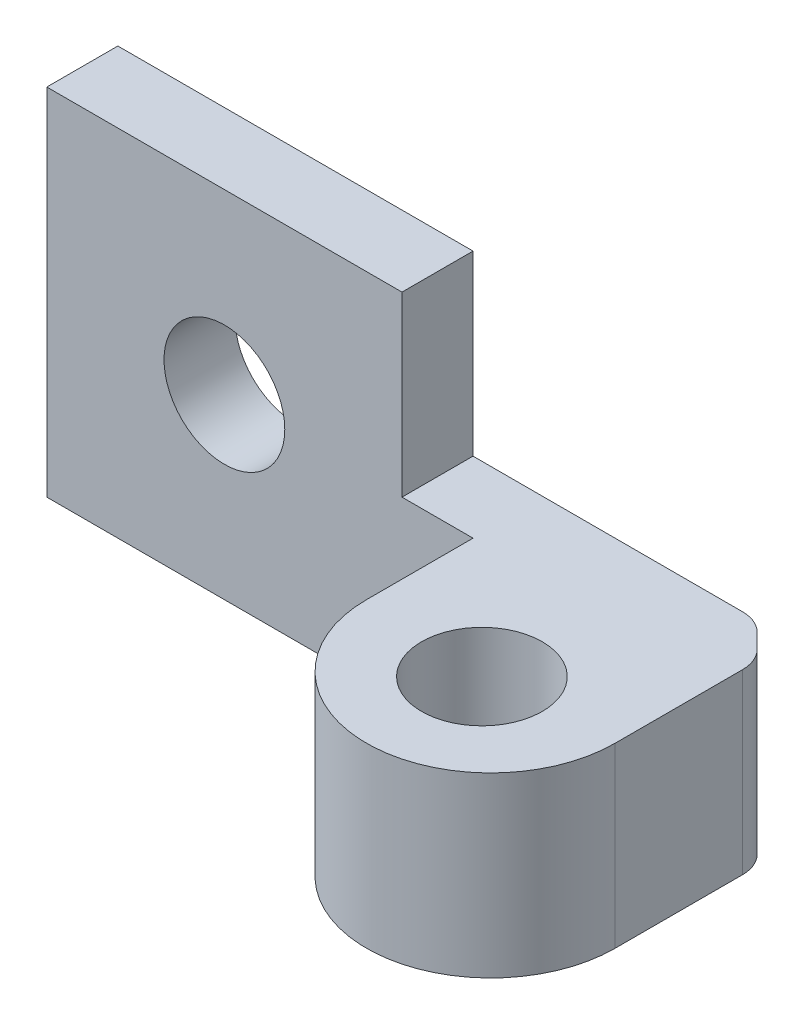
ISO-10303-21;
HEADER;
FILE_DESCRIPTION(('STEP AP214'),'2;1');
FILE_NAME('part.step','',(''),(''),'','','');
FILE_SCHEMA(('AUTOMOTIVE_DESIGN { 1 0 10303 214 1 1 1 1 }'));
ENDSEC;
DATA;
#1=APPLICATION_CONTEXT('core data for automotive mechanical design processes');
#2=APPLICATION_PROTOCOL_DEFINITION('international standard','automotive_design',2000,#1);
#3=PRODUCT_CONTEXT('',#1,'mechanical');
#4=PRODUCT('Part','Part','',(#3));
#5=PRODUCT_RELATED_PRODUCT_CATEGORY('part','',(#4));
#6=PRODUCT_DEFINITION_FORMATION('','',#4);
#7=PRODUCT_DEFINITION_CONTEXT('part definition',#1,'design');
#8=PRODUCT_DEFINITION('design','',#6,#7);
#9=PRODUCT_DEFINITION_SHAPE('','',#8);
#10=(LENGTH_UNIT() NAMED_UNIT(*) SI_UNIT(.MILLI.,.METRE.));
#11=(NAMED_UNIT(*) PLANE_ANGLE_UNIT() SI_UNIT($,.RADIAN.));
#12=(NAMED_UNIT(*) SI_UNIT($,.STERADIAN.) SOLID_ANGLE_UNIT());
#13=UNCERTAINTY_MEASURE_WITH_UNIT(LENGTH_MEASURE(1.E-05),#10,'distance_accuracy_value','');
#14=(GEOMETRIC_REPRESENTATION_CONTEXT(3) GLOBAL_UNCERTAINTY_ASSIGNED_CONTEXT((#13)) GLOBAL_UNIT_ASSIGNED_CONTEXT((#10,
#11,#12)) REPRESENTATION_CONTEXT('',''));
#15=CARTESIAN_POINT('',(0.,0.,0.));
#16=DIRECTION('',(0.,0.,1.));
#17=DIRECTION('',(1.,0.,0.));
#18=AXIS2_PLACEMENT_3D('',#15,#16,#17);
#19=CARTESIAN_POINT('',(10.5,-5.,5.));
#20=DIRECTION('',(0.,-1.,0.));
#21=DIRECTION('',(0.,0.,-1.));
#22=AXIS2_PLACEMENT_3D('',#19,#20,#21);
#23=CYLINDRICAL_SURFACE('',#22,3.5);
#24=DIRECTION('',(0.,-1.,0.));
#25=VECTOR('',#24,1.);
#26=CARTESIAN_POINT('',(7.,0.,5.));
#27=LINE('',#26,#25);
#28=CARTESIAN_POINT('',(7.,-5.,5.));
#29=VERTEX_POINT('',#28);
#30=CARTESIAN_POINT('',(7.,0.,5.));
#31=VERTEX_POINT('',#30);
#32=EDGE_CURVE('E167',#29,#31,#27,.F.);
#33=ORIENTED_EDGE('',*,*,#32,.F.);
#34=CARTESIAN_POINT('',(10.5,-5.,5.));
#35=DIRECTION('',(0.,1.,0.));
#36=DIRECTION('',(-1.,0.,0.));
#37=AXIS2_PLACEMENT_3D('',#34,#35,#36);
#38=CIRCLE('',#37,3.5);
#39=CARTESIAN_POINT('',(14.,-5.,5.));
#40=VERTEX_POINT('',#39);
#41=EDGE_CURVE('E126',#40,#29,#38,.F.);
#42=ORIENTED_EDGE('',*,*,#41,.F.);
#43=DIRECTION('',(0.,-1.,0.));
#44=VECTOR('',#43,1.);
#45=CARTESIAN_POINT('',(14.,0.,5.));
#46=LINE('',#45,#44);
#47=CARTESIAN_POINT('',(14.,0.,5.));
#48=VERTEX_POINT('',#47);
#49=EDGE_CURVE('E395',#48,#40,#46,.T.);
#50=ORIENTED_EDGE('',*,*,#49,.F.);
#51=CARTESIAN_POINT('',(10.5,0.,5.));
#52=DIRECTION('',(0.,-1.,0.));
#53=DIRECTION('',(0.,0.,-1.));
#54=AXIS2_PLACEMENT_3D('',#51,#52,#53);
#55=CIRCLE('',#54,3.5);
#56=EDGE_CURVE('E397',#31,#48,#55,.F.);
#57=ORIENTED_EDGE('',*,*,#56,.F.);
#58=EDGE_LOOP('',(#33,#42,#50,#57));
#59=FACE_BOUND('',#58,.T.);
#60=ADVANCED_FACE('F34',(#59),#23,.T.);
#61=CARTESIAN_POINT('',(-5.,-5.,2.));
#62=DIRECTION('',(1.,0.,0.));
#63=DIRECTION('',(0.,0.,-1.));
#64=AXIS2_PLACEMENT_3D('',#61,#62,#63);
#65=PLANE('',#64);
#66=DIRECTION('',(0.,-1.,0.));
#67=VECTOR('',#66,1.);
#68=CARTESIAN_POINT('',(-5.,-5.,0.));
#69=LINE('',#68,#67);
#70=CARTESIAN_POINT('',(-5.,5.,0.));
#71=VERTEX_POINT('',#70);
#72=CARTESIAN_POINT('',(-5.,-5.,0.));
#73=VERTEX_POINT('',#72);
#74=EDGE_CURVE('E191',#71,#73,#69,.T.);
#75=ORIENTED_EDGE('',*,*,#74,.T.);
#76=DIRECTION('',(0.,0.,-1.));
#77=VECTOR('',#76,1.);
#78=CARTESIAN_POINT('',(-5.,-5.,2.));
#79=LINE('',#78,#77);
#80=CARTESIAN_POINT('',(-5.,-5.,2.));
#81=VERTEX_POINT('',#80);
#82=EDGE_CURVE('E165',#81,#73,#79,.T.);
#83=ORIENTED_EDGE('',*,*,#82,.F.);
#84=DIRECTION('',(0.,-1.,0.));
#85=VECTOR('',#84,1.);
#86=CARTESIAN_POINT('',(-5.,-5.,2.));
#87=LINE('',#86,#85);
#88=CARTESIAN_POINT('',(-5.,5.,2.));
#89=VERTEX_POINT('',#88);
#90=EDGE_CURVE('E139',#89,#81,#87,.T.);
#91=ORIENTED_EDGE('',*,*,#90,.F.);
#92=DIRECTION('',(0.,0.,-1.));
#93=VECTOR('',#92,1.);
#94=CARTESIAN_POINT('',(-5.,5.,2.));
#95=LINE('',#94,#93);
#96=EDGE_CURVE('E180',#89,#71,#95,.T.);
#97=ORIENTED_EDGE('',*,*,#96,.T.);
#98=EDGE_LOOP('',(#75,#83,#91,#97));
#99=FACE_BOUND('',#98,.T.);
#100=ADVANCED_FACE('F211',(#99),#65,.F.);
#101=CARTESIAN_POINT('',(14.,-5.,2.));
#102=DIRECTION('',(0.,1.,0.));
#103=DIRECTION('',(-1.,0.,0.));
#104=AXIS2_PLACEMENT_3D('',#101,#102,#103);
#105=PLANE('',#104);
#106=CARTESIAN_POINT('',(10.5,-5.,5.25));
#107=DIRECTION('',(0.,-1.,0.));
#108=DIRECTION('',(0.,0.,-1.));
#109=AXIS2_PLACEMENT_3D('',#106,#107,#108);
#110=CIRCLE('',#109,1.69999999999999);
#111=CARTESIAN_POINT('',(10.5,-5.,3.55000000000001));
#112=VERTEX_POINT('',#111);
#113=EDGE_CURVE('E286',#112,#112,#110,.T.);
#114=ORIENTED_EDGE('',*,*,#113,.F.);
#115=EDGE_LOOP('',(#114));
#116=FACE_BOUND('',#115,.T.);
#117=DIRECTION('',(1.,0.,0.));
#118=VECTOR('',#117,1.);
#119=CARTESIAN_POINT('',(14.,-5.,0.));
#120=LINE('',#119,#118);
#121=CARTESIAN_POINT('',(12.5857864376269,-5.,0.));
#122=VERTEX_POINT('',#121);
#123=EDGE_CURVE('E189',#73,#122,#120,.T.);
#124=ORIENTED_EDGE('',*,*,#123,.T.);
#125=CARTESIAN_POINT('',(12.5857864376269,-5.,1.));
#126=DIRECTION('',(0.,1.,0.));
#127=DIRECTION('',(-1.,0.,0.));
#128=AXIS2_PLACEMENT_3D('',#125,#126,#127);
#129=CIRCLE('',#128,1.);
#130=CARTESIAN_POINT('',(13.2928932188135,-5.,0.292893218813453));
#131=VERTEX_POINT('',#130);
#132=EDGE_CURVE('E213',#122,#131,#129,.F.);
#133=ORIENTED_EDGE('',*,*,#132,.T.);
#134=DIRECTION('',(-0.707106781186546,0.,-0.707106781186549));
#135=VECTOR('',#134,1.);
#136=CARTESIAN_POINT('',(14.,-5.,1.));
#137=LINE('',#136,#135);
#138=CARTESIAN_POINT('',(13.7071067811865,-5.,0.707106781186551));
#139=VERTEX_POINT('',#138);
#140=EDGE_CURVE('E222',#131,#139,#137,.F.);
#141=ORIENTED_EDGE('',*,*,#140,.T.);
#142=CARTESIAN_POINT('',(13.,-5.,1.4142135623731));
#143=DIRECTION('',(0.,1.,0.));
#144=DIRECTION('',(-1.,0.,0.));
#145=AXIS2_PLACEMENT_3D('',#142,#143,#144);
#146=CIRCLE('',#145,1.);
#147=CARTESIAN_POINT('',(14.,-5.,1.4142135623731));
#148=VERTEX_POINT('',#147);
#149=EDGE_CURVE('E221',#139,#148,#146,.F.);
#150=ORIENTED_EDGE('',*,*,#149,.T.);
#151=DIRECTION('',(0.,0.,-1.));
#152=VECTOR('',#151,1.);
#153=CARTESIAN_POINT('',(14.,-5.,2.));
#154=LINE('',#153,#152);
#155=EDGE_CURVE('E168',#40,#148,#154,.T.);
#156=ORIENTED_EDGE('',*,*,#155,.F.);
#157=ORIENTED_EDGE('',*,*,#41,.T.);
#158=DIRECTION('',(0.,0.,-1.));
#159=VECTOR('',#158,1.);
#160=CARTESIAN_POINT('',(7.,-5.,8.5));
#161=LINE('',#160,#159);
#162=CARTESIAN_POINT('',(7.,-5.,2.));
#163=VERTEX_POINT('',#162);
#164=EDGE_CURVE('E118',#29,#163,#161,.T.);
#165=ORIENTED_EDGE('',*,*,#164,.T.);
#166=DIRECTION('',(1.,0.,0.));
#167=VECTOR('',#166,1.);
#168=CARTESIAN_POINT('',(5.,-5.,2.));
#169=LINE('',#168,#167);
#170=EDGE_CURVE('E123',#81,#163,#169,.T.);
#171=ORIENTED_EDGE('',*,*,#170,.F.);
#172=ORIENTED_EDGE('',*,*,#82,.T.);
#173=EDGE_LOOP('',(#124,#133,#141,#150,#156,#157,#165,#171,#172));
#174=FACE_BOUND('',#173,.T.);
#175=ADVANCED_FACE('F121',(#116,#174),#105,.F.);
#176=CARTESIAN_POINT('',(14.,0.,2.));
#177=DIRECTION('',(-1.,0.,0.));
#178=DIRECTION('',(0.,0.,1.));
#179=AXIS2_PLACEMENT_3D('',#176,#177,#178);
#180=PLANE('',#179);
#181=ORIENTED_EDGE('',*,*,#155,.T.);
#182=DIRECTION('',(0.,-1.,0.));
#183=VECTOR('',#182,1.);
#184=CARTESIAN_POINT('',(14.,0.,1.4142135623731));
#185=LINE('',#184,#183);
#186=CARTESIAN_POINT('',(14.,0.,1.4142135623731));
#187=VERTEX_POINT('',#186);
#188=EDGE_CURVE('E11',#148,#187,#185,.F.);
#189=ORIENTED_EDGE('',*,*,#188,.T.);
#190=DIRECTION('',(0.,0.,-1.));
#191=VECTOR('',#190,1.);
#192=CARTESIAN_POINT('',(14.,0.,2.));
#193=LINE('',#192,#191);
#194=EDGE_CURVE('E171',#48,#187,#193,.T.);
#195=ORIENTED_EDGE('',*,*,#194,.F.);
#196=ORIENTED_EDGE('',*,*,#49,.T.);
#197=EDGE_LOOP('',(#181,#189,#195,#196));
#198=FACE_BOUND('',#197,.T.);
#199=ADVANCED_FACE('F255',(#198),#180,.F.);
#200=CARTESIAN_POINT('',(5.,0.,2.));
#201=DIRECTION('',(0.,-1.,0.));
#202=DIRECTION('',(0.,0.,-1.));
#203=AXIS2_PLACEMENT_3D('',#200,#201,#202);
#204=PLANE('',#203);
#205=CARTESIAN_POINT('',(10.5,0.,5.25));
#206=DIRECTION('',(0.,-1.,0.));
#207=DIRECTION('',(0.,0.,-1.));
#208=AXIS2_PLACEMENT_3D('',#205,#206,#207);
#209=CIRCLE('',#208,1.69999999999999);
#210=CARTESIAN_POINT('',(10.5,0.,3.55000000000001));
#211=VERTEX_POINT('',#210);
#212=EDGE_CURVE('E289',#211,#211,#209,.T.);
#213=ORIENTED_EDGE('',*,*,#212,.T.);
#214=EDGE_LOOP('',(#213));
#215=FACE_BOUND('',#214,.T.);
#216=DIRECTION('',(0.707106781186546,0.,0.707106781186549));
#217=VECTOR('',#216,1.);
#218=CARTESIAN_POINT('',(14.,0.,1.));
#219=LINE('',#218,#217);
#220=CARTESIAN_POINT('',(13.7071067811865,0.,0.707106781186551));
#221=VERTEX_POINT('',#220);
#222=CARTESIAN_POINT('',(13.2928932188135,0.,0.292893218813453));
#223=VERTEX_POINT('',#222);
#224=EDGE_CURVE('E225',#221,#223,#219,.F.);
#225=ORIENTED_EDGE('',*,*,#224,.T.);
#226=CARTESIAN_POINT('',(12.5857864376269,0.,1.));
#227=DIRECTION('',(0.,-1.,0.));
#228=DIRECTION('',(0.,0.,-1.));
#229=AXIS2_PLACEMENT_3D('',#226,#227,#228);
#230=CIRCLE('',#229,1.);
#231=CARTESIAN_POINT('',(12.5857864376269,0.,0.));
#232=VERTEX_POINT('',#231);
#233=EDGE_CURVE('E42',#223,#232,#230,.F.);
#234=ORIENTED_EDGE('',*,*,#233,.T.);
#235=DIRECTION('',(-1.,0.,0.));
#236=VECTOR('',#235,1.);
#237=CARTESIAN_POINT('',(5.,0.,0.));
#238=LINE('',#237,#236);
#239=CARTESIAN_POINT('',(5.,0.,0.));
#240=VERTEX_POINT('',#239);
#241=EDGE_CURVE('E187',#232,#240,#238,.T.);
#242=ORIENTED_EDGE('',*,*,#241,.T.);
#243=DIRECTION('',(0.,0.,-1.));
#244=VECTOR('',#243,1.);
#245=CARTESIAN_POINT('',(5.,0.,2.));
#246=LINE('',#245,#244);
#247=CARTESIAN_POINT('',(5.,0.,2.));
#248=VERTEX_POINT('',#247);
#249=EDGE_CURVE('E174',#248,#240,#246,.T.);
#250=ORIENTED_EDGE('',*,*,#249,.F.);
#251=DIRECTION('',(-1.,0.,0.));
#252=VECTOR('',#251,1.);
#253=CARTESIAN_POINT('',(5.,0.,2.));
#254=LINE('',#253,#252);
#255=CARTESIAN_POINT('',(7.,0.,2.));
#256=VERTEX_POINT('',#255);
#257=EDGE_CURVE('E141',#256,#248,#254,.T.);
#258=ORIENTED_EDGE('',*,*,#257,.F.);
#259=DIRECTION('',(0.,0.,-1.));
#260=VECTOR('',#259,1.);
#261=CARTESIAN_POINT('',(7.,0.,8.5));
#262=LINE('',#261,#260);
#263=EDGE_CURVE('E131',#31,#256,#262,.T.);
#264=ORIENTED_EDGE('',*,*,#263,.F.);
#265=ORIENTED_EDGE('',*,*,#56,.T.);
#266=ORIENTED_EDGE('',*,*,#194,.T.);
#267=CARTESIAN_POINT('',(13.,0.,1.4142135623731));
#268=DIRECTION('',(0.,-1.,0.));
#269=DIRECTION('',(0.,0.,-1.));
#270=AXIS2_PLACEMENT_3D('',#267,#268,#269);
#271=CIRCLE('',#270,1.);
#272=EDGE_CURVE('E49',#187,#221,#271,.F.);
#273=ORIENTED_EDGE('',*,*,#272,.T.);
#274=EDGE_LOOP('',(#225,#234,#242,#250,#258,#264,#265,#266,#273));
#275=FACE_BOUND('',#274,.T.);
#276=ADVANCED_FACE('F199',(#215,#275),#204,.F.);
#277=CARTESIAN_POINT('',(5.,5.,2.));
#278=DIRECTION('',(-1.,0.,0.));
#279=DIRECTION('',(0.,-1.,0.));
#280=AXIS2_PLACEMENT_3D('',#277,#278,#279);
#281=PLANE('',#280);
#282=DIRECTION('',(0.,1.,0.));
#283=VECTOR('',#282,1.);
#284=CARTESIAN_POINT('',(5.,5.,0.));
#285=LINE('',#284,#283);
#286=CARTESIAN_POINT('',(5.,5.,0.));
#287=VERTEX_POINT('',#286);
#288=EDGE_CURVE('E185',#240,#287,#285,.T.);
#289=ORIENTED_EDGE('',*,*,#288,.T.);
#290=DIRECTION('',(0.,0.,-1.));
#291=VECTOR('',#290,1.);
#292=CARTESIAN_POINT('',(5.,5.,2.));
#293=LINE('',#292,#291);
#294=CARTESIAN_POINT('',(5.,5.,2.));
#295=VERTEX_POINT('',#294);
#296=EDGE_CURVE('E177',#295,#287,#293,.T.);
#297=ORIENTED_EDGE('',*,*,#296,.F.);
#298=DIRECTION('',(0.,1.,0.));
#299=VECTOR('',#298,1.);
#300=CARTESIAN_POINT('',(5.,5.,2.));
#301=LINE('',#300,#299);
#302=EDGE_CURVE('E194',#248,#295,#301,.T.);
#303=ORIENTED_EDGE('',*,*,#302,.F.);
#304=ORIENTED_EDGE('',*,*,#249,.T.);
#305=EDGE_LOOP('',(#289,#297,#303,#304));
#306=FACE_BOUND('',#305,.T.);
#307=ADVANCED_FACE('F203',(#306),#281,.F.);
#308=CARTESIAN_POINT('',(5.,5.,2.));
#309=DIRECTION('',(0.,-1.,0.));
#310=DIRECTION('',(1.,0.,0.));
#311=AXIS2_PLACEMENT_3D('',#308,#309,#310);
#312=PLANE('',#311);
#313=DIRECTION('',(-1.,0.,0.));
#314=VECTOR('',#313,1.);
#315=CARTESIAN_POINT('',(5.,5.,0.));
#316=LINE('',#315,#314);
#317=EDGE_CURVE('E160',#287,#71,#316,.T.);
#318=ORIENTED_EDGE('',*,*,#317,.T.);
#319=ORIENTED_EDGE('',*,*,#96,.F.);
#320=DIRECTION('',(-1.,0.,0.));
#321=VECTOR('',#320,1.);
#322=CARTESIAN_POINT('',(5.,5.,2.));
#323=LINE('',#322,#321);
#324=EDGE_CURVE('E183',#295,#89,#323,.T.);
#325=ORIENTED_EDGE('',*,*,#324,.F.);
#326=ORIENTED_EDGE('',*,*,#296,.T.);
#327=EDGE_LOOP('',(#318,#319,#325,#326));
#328=FACE_BOUND('',#327,.T.);
#329=ADVANCED_FACE('F208',(#328),#312,.F.);
#330=CARTESIAN_POINT('',(0.,0.,2.));
#331=DIRECTION('',(0.,0.,1.));
#332=DIRECTION('',(1.,0.,0.));
#333=AXIS2_PLACEMENT_3D('',#330,#331,#332);
#334=PLANE('',#333);
#335=CARTESIAN_POINT('',(0.,0.,2.));
#336=DIRECTION('',(0.,0.,1.));
#337=DIRECTION('',(1.,0.,0.));
#338=AXIS2_PLACEMENT_3D('',#335,#336,#337);
#339=CIRCLE('',#338,1.69999999999999);
#340=CARTESIAN_POINT('',(1.69999999999999,0.,2.));
#341=VERTEX_POINT('',#340);
#342=EDGE_CURVE('E148',#341,#341,#339,.T.);
#343=ORIENTED_EDGE('',*,*,#342,.F.);
#344=EDGE_LOOP('',(#343));
#345=FACE_BOUND('',#344,.T.);
#346=DIRECTION('',(0.,-1.,0.));
#347=VECTOR('',#346,1.);
#348=CARTESIAN_POINT('',(7.,0.,2.));
#349=LINE('',#348,#347);
#350=EDGE_CURVE('E132',#256,#163,#349,.T.);
#351=ORIENTED_EDGE('',*,*,#350,.F.);
#352=ORIENTED_EDGE('',*,*,#257,.T.);
#353=ORIENTED_EDGE('',*,*,#302,.T.);
#354=ORIENTED_EDGE('',*,*,#324,.T.);
#355=ORIENTED_EDGE('',*,*,#90,.T.);
#356=ORIENTED_EDGE('',*,*,#170,.T.);
#357=EDGE_LOOP('',(#351,#352,#353,#354,#355,#356));
#358=FACE_BOUND('',#357,.T.);
#359=ADVANCED_FACE('F136',(#345,#358),#334,.T.);
#360=CARTESIAN_POINT('',(0.,0.,0.));
#361=DIRECTION('',(0.,0.,1.));
#362=DIRECTION('',(1.,0.,0.));
#363=AXIS2_PLACEMENT_3D('',#360,#361,#362);
#364=PLANE('',#363);
#365=CARTESIAN_POINT('',(0.,0.,0.));
#366=DIRECTION('',(0.,0.,1.));
#367=DIRECTION('',(1.,0.,0.));
#368=AXIS2_PLACEMENT_3D('',#365,#366,#367);
#369=CIRCLE('',#368,1.69999999999999);
#370=CARTESIAN_POINT('',(1.69999999999999,0.,0.));
#371=VERTEX_POINT('',#370);
#372=EDGE_CURVE('E145',#371,#371,#369,.T.);
#373=ORIENTED_EDGE('',*,*,#372,.T.);
#374=EDGE_LOOP('',(#373));
#375=FACE_BOUND('',#374,.T.);
#376=ORIENTED_EDGE('',*,*,#241,.F.);
#377=DIRECTION('',(0.,1.,0.));
#378=VECTOR('',#377,1.);
#379=CARTESIAN_POINT('',(12.5857864376269,-5.,0.));
#380=LINE('',#379,#378);
#381=EDGE_CURVE('E218',#232,#122,#380,.F.);
#382=ORIENTED_EDGE('',*,*,#381,.T.);
#383=ORIENTED_EDGE('',*,*,#123,.F.);
#384=ORIENTED_EDGE('',*,*,#74,.F.);
#385=ORIENTED_EDGE('',*,*,#317,.F.);
#386=ORIENTED_EDGE('',*,*,#288,.F.);
#387=EDGE_LOOP('',(#376,#382,#383,#384,#385,#386));
#388=FACE_BOUND('',#387,.T.);
#389=ADVANCED_FACE('F216',(#375,#388),#364,.F.);
#390=CARTESIAN_POINT('',(7.,0.,8.5));
#391=DIRECTION('',(1.,0.,0.));
#392=DIRECTION('',(0.,0.,-1.));
#393=AXIS2_PLACEMENT_3D('',#390,#391,#392);
#394=PLANE('',#393);
#395=ORIENTED_EDGE('',*,*,#164,.F.);
#396=ORIENTED_EDGE('',*,*,#32,.T.);
#397=ORIENTED_EDGE('',*,*,#263,.T.);
#398=ORIENTED_EDGE('',*,*,#350,.T.);
#399=EDGE_LOOP('',(#395,#396,#397,#398));
#400=FACE_BOUND('',#399,.T.);
#401=ADVANCED_FACE('F143',(#400),#394,.F.);
#402=CARTESIAN_POINT('',(0.,0.,2.));
#403=DIRECTION('',(0.,0.,1.));
#404=DIRECTION('',(1.,0.,0.));
#405=AXIS2_PLACEMENT_3D('',#402,#403,#404);
#406=CYLINDRICAL_SURFACE('',#405,1.69999999999999);
#407=ORIENTED_EDGE('',*,*,#372,.F.);
#408=EDGE_LOOP('',(#407));
#409=FACE_BOUND('',#408,.T.);
#410=ORIENTED_EDGE('',*,*,#342,.T.);
#411=EDGE_LOOP('',(#410));
#412=FACE_BOUND('',#411,.T.);
#413=ADVANCED_FACE('F275',(#409,#412),#406,.F.);
#414=CARTESIAN_POINT('',(10.5,-5.,5.25));
#415=DIRECTION('',(0.,-1.,0.));
#416=DIRECTION('',(0.,0.,-1.));
#417=AXIS2_PLACEMENT_3D('',#414,#415,#416);
#418=CYLINDRICAL_SURFACE('',#417,1.69999999999999);
#419=ORIENTED_EDGE('',*,*,#113,.T.);
#420=EDGE_LOOP('',(#419));
#421=FACE_BOUND('',#420,.T.);
#422=ORIENTED_EDGE('',*,*,#212,.F.);
#423=EDGE_LOOP('',(#422));
#424=FACE_BOUND('',#423,.T.);
#425=ADVANCED_FACE('F240',(#421,#424),#418,.F.);
#426=CARTESIAN_POINT('',(14.,0.,1.));
#427=DIRECTION('',(-0.707106781186549,0.,0.707106781186546));
#428=DIRECTION('',(0.,1.,0.));
#429=AXIS2_PLACEMENT_3D('',#426,#427,#428);
#430=PLANE('',#429);
#431=ORIENTED_EDGE('',*,*,#140,.F.);
#432=DIRECTION('',(0.,-1.,0.));
#433=VECTOR('',#432,1.);
#434=CARTESIAN_POINT('',(13.2928932188135,0.,0.292893218813453));
#435=LINE('',#434,#433);
#436=EDGE_CURVE('E56',#131,#223,#435,.F.);
#437=ORIENTED_EDGE('',*,*,#436,.T.);
#438=ORIENTED_EDGE('',*,*,#224,.F.);
#439=DIRECTION('',(0.,1.,0.));
#440=VECTOR('',#439,1.);
#441=CARTESIAN_POINT('',(13.7071067811865,-5.,0.707106781186551));
#442=LINE('',#441,#440);
#443=EDGE_CURVE('E230',#221,#139,#442,.F.);
#444=ORIENTED_EDGE('',*,*,#443,.T.);
#445=EDGE_LOOP('',(#431,#437,#438,#444));
#446=FACE_BOUND('',#445,.T.);
#447=ADVANCED_FACE('F235',(#446),#430,.F.);
#448=CARTESIAN_POINT('',(12.5857864376269,0.,1.));
#449=DIRECTION('',(0.,-1.,0.));
#450=DIRECTION('',(0.,0.,-1.));
#451=AXIS2_PLACEMENT_3D('',#448,#449,#450);
#452=CYLINDRICAL_SURFACE('',#451,1.);
#453=ORIENTED_EDGE('',*,*,#233,.F.);
#454=ORIENTED_EDGE('',*,*,#436,.F.);
#455=ORIENTED_EDGE('',*,*,#132,.F.);
#456=ORIENTED_EDGE('',*,*,#381,.F.);
#457=EDGE_LOOP('',(#453,#454,#455,#456));
#458=FACE_BOUND('',#457,.T.);
#459=ADVANCED_FACE('F233',(#458),#452,.T.);
#460=CARTESIAN_POINT('',(13.,0.,1.4142135623731));
#461=DIRECTION('',(0.,1.,0.));
#462=DIRECTION('',(0.,0.,1.));
#463=AXIS2_PLACEMENT_3D('',#460,#461,#462);
#464=CYLINDRICAL_SURFACE('',#463,1.);
#465=ORIENTED_EDGE('',*,*,#149,.F.);
#466=ORIENTED_EDGE('',*,*,#443,.F.);
#467=ORIENTED_EDGE('',*,*,#272,.F.);
#468=ORIENTED_EDGE('',*,*,#188,.F.);
#469=EDGE_LOOP('',(#465,#466,#467,#468));
#470=FACE_BOUND('',#469,.T.);
#471=ADVANCED_FACE('F36',(#470),#464,.T.);
#472=CLOSED_SHELL('',(#60,#100,#175,#199,#276,#307,#329,#359,#389,#401,#413,#425,#447,#459,#471));
#473=MANIFOLD_SOLID_BREP('B2',#472);
#474=ADVANCED_BREP_SHAPE_REPRESENTATION('',(#18,#473),#14);
#475=SHAPE_DEFINITION_REPRESENTATION(#9,#474);
ENDSEC;
END-ISO-10303-21;
